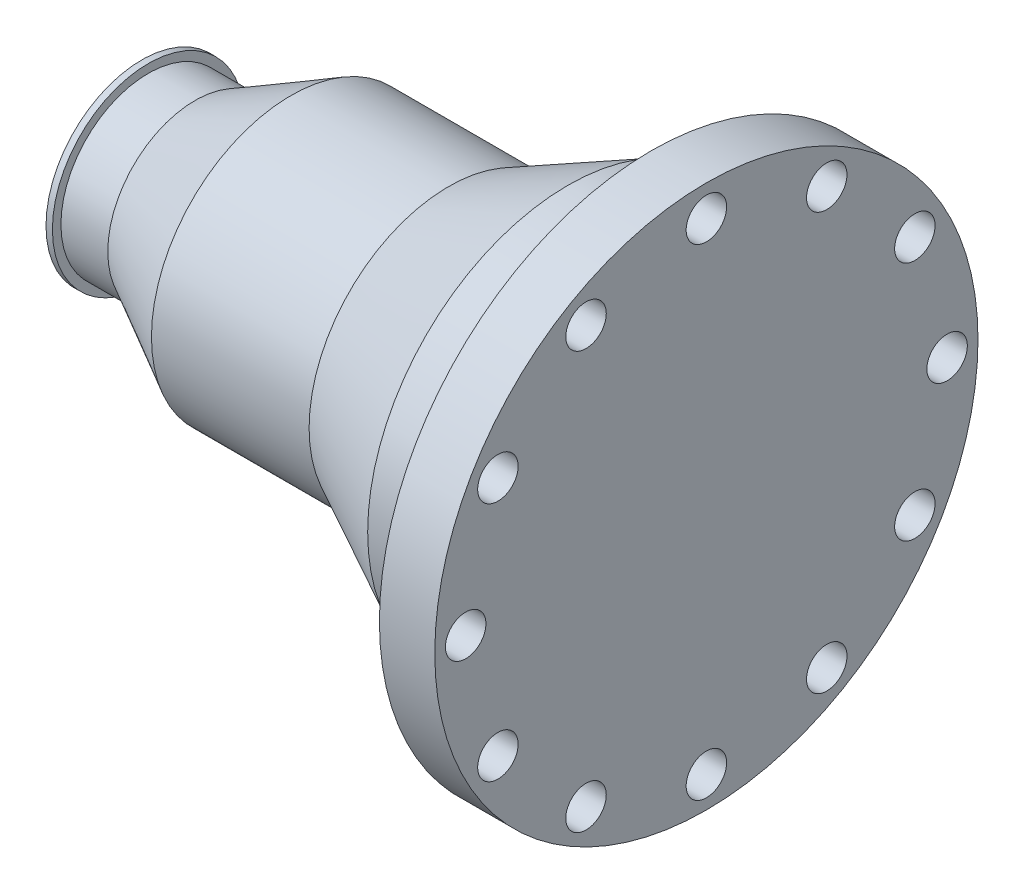
ISO-10303-21;
HEADER;
FILE_DESCRIPTION(('STEP AP214'),'2;1');
FILE_NAME('part.step','',(''),(''),'','','');
FILE_SCHEMA(('AUTOMOTIVE_DESIGN { 1 0 10303 214 1 1 1 1 }'));
ENDSEC;
DATA;
#1=APPLICATION_CONTEXT('core data for automotive mechanical design processes');
#2=APPLICATION_PROTOCOL_DEFINITION('international standard','automotive_design',2000,#1);
#3=PRODUCT_CONTEXT('',#1,'mechanical');
#4=PRODUCT('Part','Part','',(#3));
#5=PRODUCT_RELATED_PRODUCT_CATEGORY('part','',(#4));
#6=PRODUCT_DEFINITION_FORMATION('','',#4);
#7=PRODUCT_DEFINITION_CONTEXT('part definition',#1,'design');
#8=PRODUCT_DEFINITION('design','',#6,#7);
#9=PRODUCT_DEFINITION_SHAPE('','',#8);
#10=(LENGTH_UNIT() NAMED_UNIT(*) SI_UNIT(.MILLI.,.METRE.));
#11=(NAMED_UNIT(*) PLANE_ANGLE_UNIT() SI_UNIT($,.RADIAN.));
#12=(NAMED_UNIT(*) SI_UNIT($,.STERADIAN.) SOLID_ANGLE_UNIT());
#13=UNCERTAINTY_MEASURE_WITH_UNIT(LENGTH_MEASURE(1.E-05),#10,'distance_accuracy_value','');
#14=(GEOMETRIC_REPRESENTATION_CONTEXT(3) GLOBAL_UNCERTAINTY_ASSIGNED_CONTEXT((#13)) GLOBAL_UNIT_ASSIGNED_CONTEXT((#10,
#11,#12)) REPRESENTATION_CONTEXT('',''));
#15=CARTESIAN_POINT('',(0.,0.,0.));
#16=DIRECTION('',(0.,0.,1.));
#17=DIRECTION('',(1.,0.,0.));
#18=AXIS2_PLACEMENT_3D('',#15,#16,#17);
#19=CARTESIAN_POINT('',(0.,0.,0.));
#20=DIRECTION('',(1.,0.,0.));
#21=DIRECTION('',(0.,0.,-1.));
#22=AXIS2_PLACEMENT_3D('',#19,#20,#21);
#23=PLANE('',#22);
#24=CARTESIAN_POINT('',(0.,0.,0.));
#25=DIRECTION('',(-1.,0.,0.));
#26=DIRECTION('',(0.,0.,1.));
#27=AXIS2_PLACEMENT_3D('',#24,#25,#26);
#28=CIRCLE('',#27,45.);
#29=CARTESIAN_POINT('',(0.,0.,45.));
#30=VERTEX_POINT('',#29);
#31=EDGE_CURVE('E10',#30,#30,#28,.T.);
#32=ORIENTED_EDGE('',*,*,#31,.T.);
#33=EDGE_LOOP('',(#32));
#34=FACE_BOUND('',#33,.T.);
#35=ADVANCED_FACE('F37',(#34),#23,.F.);
#36=CARTESIAN_POINT('',(0.,0.,0.));
#37=DIRECTION('',(-1.,0.,0.));
#38=DIRECTION('',(0.,0.,1.));
#39=AXIS2_PLACEMENT_3D('',#36,#37,#38);
#40=CYLINDRICAL_SURFACE('',#39,45.);
#41=ORIENTED_EDGE('',*,*,#31,.F.);
#42=EDGE_LOOP('',(#41));
#43=FACE_BOUND('',#42,.T.);
#44=CARTESIAN_POINT('',(3.,0.,0.));
#45=DIRECTION('',(-1.,0.,0.));
#46=DIRECTION('',(0.,0.,1.));
#47=AXIS2_PLACEMENT_3D('',#44,#45,#46);
#48=CIRCLE('',#47,45.);
#49=CARTESIAN_POINT('',(3.,0.,45.));
#50=VERTEX_POINT('',#49);
#51=EDGE_CURVE('E43',#50,#50,#48,.T.);
#52=ORIENTED_EDGE('',*,*,#51,.T.);
#53=EDGE_LOOP('',(#52));
#54=FACE_BOUND('',#53,.T.);
#55=ADVANCED_FACE('F200',(#43,#54),#40,.T.);
#56=CARTESIAN_POINT('',(3.,45.,0.));
#57=DIRECTION('',(-1.,0.,0.));
#58=DIRECTION('',(0.,0.,1.));
#59=AXIS2_PLACEMENT_3D('',#56,#57,#58);
#60=PLANE('',#59);
#61=ORIENTED_EDGE('',*,*,#51,.F.);
#62=EDGE_LOOP('',(#61));
#63=FACE_BOUND('',#62,.T.);
#64=CARTESIAN_POINT('',(3.,0.,0.));
#65=DIRECTION('',(-1.,0.,0.));
#66=DIRECTION('',(0.,0.,1.));
#67=AXIS2_PLACEMENT_3D('',#64,#65,#66);
#68=CIRCLE('',#67,41.);
#69=CARTESIAN_POINT('',(3.,0.,41.));
#70=VERTEX_POINT('',#69);
#71=EDGE_CURVE('E47',#70,#70,#68,.T.);
#72=ORIENTED_EDGE('',*,*,#71,.T.);
#73=EDGE_LOOP('',(#72));
#74=FACE_BOUND('',#73,.T.);
#75=ADVANCED_FACE('F204',(#63,#74),#60,.F.);
#76=CARTESIAN_POINT('',(0.,0.,0.));
#77=DIRECTION('',(-1.,0.,0.));
#78=DIRECTION('',(0.,0.,1.));
#79=AXIS2_PLACEMENT_3D('',#76,#77,#78);
#80=CYLINDRICAL_SURFACE('',#79,41.);
#81=ORIENTED_EDGE('',*,*,#71,.F.);
#82=EDGE_LOOP('',(#81));
#83=FACE_BOUND('',#82,.T.);
#84=CARTESIAN_POINT('',(25.,0.,0.));
#85=DIRECTION('',(-1.,0.,0.));
#86=DIRECTION('',(0.,0.,1.));
#87=AXIS2_PLACEMENT_3D('',#84,#85,#86);
#88=CIRCLE('',#87,41.);
#89=CARTESIAN_POINT('',(25.,0.,41.));
#90=VERTEX_POINT('',#89);
#91=EDGE_CURVE('E51',#90,#90,#88,.T.);
#92=ORIENTED_EDGE('',*,*,#91,.T.);
#93=EDGE_LOOP('',(#92));
#94=FACE_BOUND('',#93,.T.);
#95=ADVANCED_FACE('F209',(#83,#94),#80,.T.);
#96=CARTESIAN_POINT('',(70.,0.,0.));
#97=DIRECTION('',(1.,0.,0.));
#98=DIRECTION('',(0.,0.,-1.));
#99=AXIS2_PLACEMENT_3D('',#96,#97,#98);
#100=CONICAL_SURFACE('',#99,65.5,0.498567905638218);
#101=ORIENTED_EDGE('',*,*,#91,.F.);
#102=EDGE_LOOP('',(#101));
#103=FACE_BOUND('',#102,.T.);
#104=CARTESIAN_POINT('',(70.,0.,0.));
#105=DIRECTION('',(-1.,0.,0.));
#106=DIRECTION('',(0.,0.,1.));
#107=AXIS2_PLACEMENT_3D('',#104,#105,#106);
#108=CIRCLE('',#107,65.5);
#109=CARTESIAN_POINT('',(70.,0.,65.5));
#110=VERTEX_POINT('',#109);
#111=EDGE_CURVE('E56',#110,#110,#108,.T.);
#112=ORIENTED_EDGE('',*,*,#111,.T.);
#113=EDGE_LOOP('',(#112));
#114=FACE_BOUND('',#113,.T.);
#115=ADVANCED_FACE('F215',(#103,#114),#100,.T.);
#116=CARTESIAN_POINT('',(0.,0.,0.));
#117=DIRECTION('',(-1.,0.,0.));
#118=DIRECTION('',(0.,0.,1.));
#119=AXIS2_PLACEMENT_3D('',#116,#117,#118);
#120=CYLINDRICAL_SURFACE('',#119,65.5);
#121=ORIENTED_EDGE('',*,*,#111,.F.);
#122=EDGE_LOOP('',(#121));
#123=FACE_BOUND('',#122,.T.);
#124=CARTESIAN_POINT('',(144.,0.,0.));
#125=DIRECTION('',(-1.,0.,0.));
#126=DIRECTION('',(0.,0.,1.));
#127=AXIS2_PLACEMENT_3D('',#124,#125,#126);
#128=CIRCLE('',#127,65.5);
#129=CARTESIAN_POINT('',(144.,0.,65.5));
#130=VERTEX_POINT('',#129);
#131=EDGE_CURVE('E59',#130,#130,#128,.T.);
#132=ORIENTED_EDGE('',*,*,#131,.T.);
#133=EDGE_LOOP('',(#132));
#134=FACE_BOUND('',#133,.T.);
#135=ADVANCED_FACE('F219',(#123,#134),#120,.T.);
#136=CARTESIAN_POINT('',(200.,0.,0.));
#137=DIRECTION('',(1.,0.,0.));
#138=DIRECTION('',(0.,0.,-1.));
#139=AXIS2_PLACEMENT_3D('',#136,#137,#138);
#140=CONICAL_SURFACE('',#139,94.,0.470764926542016);
#141=ORIENTED_EDGE('',*,*,#131,.F.);
#142=EDGE_LOOP('',(#141));
#143=FACE_BOUND('',#142,.T.);
#144=CARTESIAN_POINT('',(200.,0.,0.));
#145=DIRECTION('',(-1.,0.,0.));
#146=DIRECTION('',(0.,0.,1.));
#147=AXIS2_PLACEMENT_3D('',#144,#145,#146);
#148=CIRCLE('',#147,94.);
#149=CARTESIAN_POINT('',(200.,0.,94.));
#150=VERTEX_POINT('',#149);
#151=EDGE_CURVE('E62',#150,#150,#148,.T.);
#152=ORIENTED_EDGE('',*,*,#151,.T.);
#153=EDGE_LOOP('',(#152));
#154=FACE_BOUND('',#153,.T.);
#155=ADVANCED_FACE('F223',(#143,#154),#140,.T.);
#156=CARTESIAN_POINT('',(0.,0.,0.));
#157=DIRECTION('',(-1.,0.,0.));
#158=DIRECTION('',(0.,0.,1.));
#159=AXIS2_PLACEMENT_3D('',#156,#157,#158);
#160=CYLINDRICAL_SURFACE('',#159,94.);
#161=ORIENTED_EDGE('',*,*,#151,.F.);
#162=EDGE_LOOP('',(#161));
#163=FACE_BOUND('',#162,.T.);
#164=CARTESIAN_POINT('',(220.,0.,0.));
#165=DIRECTION('',(-1.,0.,0.));
#166=DIRECTION('',(0.,0.,1.));
#167=AXIS2_PLACEMENT_3D('',#164,#165,#166);
#168=CIRCLE('',#167,94.);
#169=CARTESIAN_POINT('',(220.,0.,94.));
#170=VERTEX_POINT('',#169);
#171=EDGE_CURVE('E65',#170,#170,#168,.T.);
#172=ORIENTED_EDGE('',*,*,#171,.T.);
#173=EDGE_LOOP('',(#172));
#174=FACE_BOUND('',#173,.T.);
#175=ADVANCED_FACE('F227',(#163,#174),#160,.T.);
#176=CARTESIAN_POINT('',(220.,94.,0.));
#177=DIRECTION('',(1.,0.,0.));
#178=DIRECTION('',(0.,0.,-1.));
#179=AXIS2_PLACEMENT_3D('',#176,#177,#178);
#180=PLANE('',#179);
#181=ORIENTED_EDGE('',*,*,#171,.F.);
#182=EDGE_LOOP('',(#181));
#183=FACE_BOUND('',#182,.T.);
#184=CARTESIAN_POINT('',(220.,0.,0.));
#185=DIRECTION('',(-1.,0.,0.));
#186=DIRECTION('',(0.,0.,1.));
#187=AXIS2_PLACEMENT_3D('',#184,#185,#186);
#188=CIRCLE('',#187,95.);
#189=CARTESIAN_POINT('',(220.,0.,95.));
#190=VERTEX_POINT('',#189);
#191=EDGE_CURVE('E68',#190,#190,#188,.T.);
#192=ORIENTED_EDGE('',*,*,#191,.T.);
#193=EDGE_LOOP('',(#192));
#194=FACE_BOUND('',#193,.T.);
#195=ADVANCED_FACE('F231',(#183,#194),#180,.F.);
#196=CARTESIAN_POINT('',(0.,0.,0.));
#197=DIRECTION('',(-1.,0.,0.));
#198=DIRECTION('',(0.,0.,1.));
#199=AXIS2_PLACEMENT_3D('',#196,#197,#198);
#200=CYLINDRICAL_SURFACE('',#199,95.);
#201=ORIENTED_EDGE('',*,*,#191,.F.);
#202=EDGE_LOOP('',(#201));
#203=FACE_BOUND('',#202,.T.);
#204=CARTESIAN_POINT('',(239.,0.,0.));
#205=DIRECTION('',(-1.,0.,0.));
#206=DIRECTION('',(0.,0.,1.));
#207=AXIS2_PLACEMENT_3D('',#204,#205,#206);
#208=CIRCLE('',#207,95.);
#209=CARTESIAN_POINT('',(239.,0.,95.));
#210=VERTEX_POINT('',#209);
#211=EDGE_CURVE('E71',#210,#210,#208,.T.);
#212=ORIENTED_EDGE('',*,*,#211,.T.);
#213=EDGE_LOOP('',(#212));
#214=FACE_BOUND('',#213,.T.);
#215=ADVANCED_FACE('F195',(#203,#214),#200,.T.);
#216=CARTESIAN_POINT('',(239.,100.,0.));
#217=DIRECTION('',(1.,0.,0.));
#218=DIRECTION('',(0.,0.,-1.));
#219=AXIS2_PLACEMENT_3D('',#216,#217,#218);
#220=PLANE('',#219);
#221=CARTESIAN_POINT('',(239.,97.8608706276416,-56.5));
#222=DIRECTION('',(1.,0.,0.));
#223=DIRECTION('',(0.,0.,-1.));
#224=AXIS2_PLACEMENT_3D('',#221,#222,#223);
#225=CIRCLE('',#224,9.50000000000001);
#226=CARTESIAN_POINT('',(239.,97.8608706276416,-66.));
#227=VERTEX_POINT('',#226);
#228=EDGE_CURVE('E146',#227,#227,#225,.F.);
#229=ORIENTED_EDGE('',*,*,#228,.F.);
#230=EDGE_LOOP('',(#229));
#231=FACE_BOUND('',#230,.T.);
#232=CARTESIAN_POINT('',(239.,56.4999999999999,-97.8608706276416));
#233=DIRECTION('',(1.,0.,0.));
#234=DIRECTION('',(0.,0.,-1.));
#235=AXIS2_PLACEMENT_3D('',#232,#233,#234);
#236=CIRCLE('',#235,9.5);
#237=CARTESIAN_POINT('',(239.,56.4999999999999,-107.360870627642));
#238=VERTEX_POINT('',#237);
#239=EDGE_CURVE('E140',#238,#238,#236,.F.);
#240=ORIENTED_EDGE('',*,*,#239,.F.);
#241=EDGE_LOOP('',(#240));
#242=FACE_BOUND('',#241,.T.);
#243=CARTESIAN_POINT('',(239.,0.,-113.));
#244=DIRECTION('',(1.,0.,0.));
#245=DIRECTION('',(0.,0.,-1.));
#246=AXIS2_PLACEMENT_3D('',#243,#244,#245);
#247=CIRCLE('',#246,9.49999999999999);
#248=CARTESIAN_POINT('',(239.,0.,-122.5));
#249=VERTEX_POINT('',#248);
#250=EDGE_CURVE('E134',#249,#249,#247,.F.);
#251=ORIENTED_EDGE('',*,*,#250,.F.);
#252=EDGE_LOOP('',(#251));
#253=FACE_BOUND('',#252,.T.);
#254=CARTESIAN_POINT('',(239.,-56.5,-97.8608706276415));
#255=DIRECTION('',(1.,0.,0.));
#256=DIRECTION('',(0.,0.,-1.));
#257=AXIS2_PLACEMENT_3D('',#254,#255,#256);
#258=CIRCLE('',#257,9.5);
#259=CARTESIAN_POINT('',(239.,-56.5,-107.360870627642));
#260=VERTEX_POINT('',#259);
#261=EDGE_CURVE('E128',#260,#260,#258,.F.);
#262=ORIENTED_EDGE('',*,*,#261,.F.);
#263=EDGE_LOOP('',(#262));
#264=FACE_BOUND('',#263,.T.);
#265=CARTESIAN_POINT('',(239.,-97.8608706276416,-56.5));
#266=DIRECTION('',(1.,0.,0.));
#267=DIRECTION('',(0.,0.,-1.));
#268=AXIS2_PLACEMENT_3D('',#265,#266,#267);
#269=CIRCLE('',#268,9.50000000000001);
#270=CARTESIAN_POINT('',(239.,-97.8608706276416,-66.));
#271=VERTEX_POINT('',#270);
#272=EDGE_CURVE('E122',#271,#271,#269,.F.);
#273=ORIENTED_EDGE('',*,*,#272,.F.);
#274=EDGE_LOOP('',(#273));
#275=FACE_BOUND('',#274,.T.);
#276=CARTESIAN_POINT('',(239.,-113.,0.));
#277=DIRECTION('',(1.,0.,0.));
#278=DIRECTION('',(0.,0.,-1.));
#279=AXIS2_PLACEMENT_3D('',#276,#277,#278);
#280=CIRCLE('',#279,9.49999999999998);
#281=CARTESIAN_POINT('',(239.,-113.,-9.49999999999998));
#282=VERTEX_POINT('',#281);
#283=EDGE_CURVE('E116',#282,#282,#280,.F.);
#284=ORIENTED_EDGE('',*,*,#283,.F.);
#285=EDGE_LOOP('',(#284));
#286=FACE_BOUND('',#285,.T.);
#287=CARTESIAN_POINT('',(239.,-97.8608706276415,56.5));
#288=DIRECTION('',(1.,0.,0.));
#289=DIRECTION('',(0.,0.,-1.));
#290=AXIS2_PLACEMENT_3D('',#287,#288,#289);
#291=CIRCLE('',#290,9.5);
#292=CARTESIAN_POINT('',(239.,-97.8608706276415,47.));
#293=VERTEX_POINT('',#292);
#294=EDGE_CURVE('E110',#293,#293,#291,.F.);
#295=ORIENTED_EDGE('',*,*,#294,.F.);
#296=EDGE_LOOP('',(#295));
#297=FACE_BOUND('',#296,.T.);
#298=CARTESIAN_POINT('',(239.,-56.5,97.8608706276416));
#299=DIRECTION('',(1.,0.,0.));
#300=DIRECTION('',(0.,0.,-1.));
#301=AXIS2_PLACEMENT_3D('',#298,#299,#300);
#302=CIRCLE('',#301,9.5);
#303=CARTESIAN_POINT('',(239.,-56.5,88.3608706276416));
#304=VERTEX_POINT('',#303);
#305=EDGE_CURVE('E104',#304,#304,#302,.F.);
#306=ORIENTED_EDGE('',*,*,#305,.F.);
#307=EDGE_LOOP('',(#306));
#308=FACE_BOUND('',#307,.T.);
#309=CARTESIAN_POINT('',(239.,0.,113.));
#310=DIRECTION('',(1.,0.,0.));
#311=DIRECTION('',(0.,0.,-1.));
#312=AXIS2_PLACEMENT_3D('',#309,#310,#311);
#313=CIRCLE('',#312,9.49999999999999);
#314=CARTESIAN_POINT('',(239.,0.,103.5));
#315=VERTEX_POINT('',#314);
#316=EDGE_CURVE('E98',#315,#315,#313,.F.);
#317=ORIENTED_EDGE('',*,*,#316,.F.);
#318=EDGE_LOOP('',(#317));
#319=FACE_BOUND('',#318,.T.);
#320=CARTESIAN_POINT('',(239.,56.5,97.8608706276416));
#321=DIRECTION('',(1.,0.,0.));
#322=DIRECTION('',(0.,0.,-1.));
#323=AXIS2_PLACEMENT_3D('',#320,#321,#322);
#324=CIRCLE('',#323,9.5);
#325=CARTESIAN_POINT('',(239.,56.5,88.3608706276416));
#326=VERTEX_POINT('',#325);
#327=EDGE_CURVE('E92',#326,#326,#324,.F.);
#328=ORIENTED_EDGE('',*,*,#327,.F.);
#329=EDGE_LOOP('',(#328));
#330=FACE_BOUND('',#329,.T.);
#331=CARTESIAN_POINT('',(239.,97.8608706276416,56.5));
#332=DIRECTION('',(1.,0.,0.));
#333=DIRECTION('',(0.,0.,-1.));
#334=AXIS2_PLACEMENT_3D('',#331,#332,#333);
#335=CIRCLE('',#334,9.5);
#336=CARTESIAN_POINT('',(239.,97.8608706276416,47.));
#337=VERTEX_POINT('',#336);
#338=EDGE_CURVE('E86',#337,#337,#335,.F.);
#339=ORIENTED_EDGE('',*,*,#338,.F.);
#340=EDGE_LOOP('',(#339));
#341=FACE_BOUND('',#340,.T.);
#342=CARTESIAN_POINT('',(239.,113.,0.));
#343=DIRECTION('',(1.,0.,0.));
#344=DIRECTION('',(0.,0.,-1.));
#345=AXIS2_PLACEMENT_3D('',#342,#343,#344);
#346=CIRCLE('',#345,9.50000000000001);
#347=CARTESIAN_POINT('',(239.,113.,-9.50000000000001));
#348=VERTEX_POINT('',#347);
#349=EDGE_CURVE('E80',#348,#348,#346,.F.);
#350=ORIENTED_EDGE('',*,*,#349,.F.);
#351=EDGE_LOOP('',(#350));
#352=FACE_BOUND('',#351,.T.);
#353=ORIENTED_EDGE('',*,*,#211,.F.);
#354=EDGE_LOOP('',(#353));
#355=FACE_BOUND('',#354,.T.);
#356=CARTESIAN_POINT('',(239.,0.,0.));
#357=DIRECTION('',(-1.,0.,0.));
#358=DIRECTION('',(0.,0.,1.));
#359=AXIS2_PLACEMENT_3D('',#356,#357,#358);
#360=CIRCLE('',#359,127.5);
#361=CARTESIAN_POINT('',(239.,0.,127.5));
#362=VERTEX_POINT('',#361);
#363=EDGE_CURVE('E74',#362,#362,#360,.T.);
#364=ORIENTED_EDGE('',*,*,#363,.T.);
#365=EDGE_LOOP('',(#364));
#366=FACE_BOUND('',#365,.T.);
#367=ADVANCED_FACE('F187',(#231,#242,#253,#264,#275,#286,#297,#308,#319,#330,#341,#352,#355,
#366),#220,.F.);
#368=CARTESIAN_POINT('',(0.,0.,0.));
#369=DIRECTION('',(-1.,0.,0.));
#370=DIRECTION('',(0.,0.,1.));
#371=AXIS2_PLACEMENT_3D('',#368,#369,#370);
#372=CYLINDRICAL_SURFACE('',#371,127.5);
#373=ORIENTED_EDGE('',*,*,#363,.F.);
#374=EDGE_LOOP('',(#373));
#375=FACE_BOUND('',#374,.T.);
#376=CARTESIAN_POINT('',(265.,0.,0.));
#377=DIRECTION('',(-1.,0.,0.));
#378=DIRECTION('',(0.,0.,1.));
#379=AXIS2_PLACEMENT_3D('',#376,#377,#378);
#380=CIRCLE('',#379,127.5);
#381=CARTESIAN_POINT('',(265.,0.,127.5));
#382=VERTEX_POINT('',#381);
#383=EDGE_CURVE('E77',#382,#382,#380,.T.);
#384=ORIENTED_EDGE('',*,*,#383,.T.);
#385=EDGE_LOOP('',(#384));
#386=FACE_BOUND('',#385,.T.);
#387=ADVANCED_FACE('F160',(#375,#386),#372,.T.);
#388=CARTESIAN_POINT('',(265.,127.5,0.));
#389=DIRECTION('',(-1.,0.,0.));
#390=DIRECTION('',(0.,0.,1.));
#391=AXIS2_PLACEMENT_3D('',#388,#389,#390);
#392=PLANE('',#391);
#393=CARTESIAN_POINT('',(265.,97.8608706276416,-56.5));
#394=DIRECTION('',(1.,0.,0.));
#395=DIRECTION('',(0.,0.,-1.));
#396=AXIS2_PLACEMENT_3D('',#393,#394,#395);
#397=CIRCLE('',#396,9.50000000000001);
#398=CARTESIAN_POINT('',(265.,97.8608706276416,-66.));
#399=VERTEX_POINT('',#398);
#400=EDGE_CURVE('E149',#399,#399,#397,.T.);
#401=ORIENTED_EDGE('',*,*,#400,.F.);
#402=EDGE_LOOP('',(#401));
#403=FACE_BOUND('',#402,.T.);
#404=CARTESIAN_POINT('',(265.,56.4999999999999,-97.8608706276416));
#405=DIRECTION('',(1.,0.,0.));
#406=DIRECTION('',(0.,0.,-1.));
#407=AXIS2_PLACEMENT_3D('',#404,#405,#406);
#408=CIRCLE('',#407,9.5);
#409=CARTESIAN_POINT('',(265.,56.4999999999999,-107.360870627642));
#410=VERTEX_POINT('',#409);
#411=EDGE_CURVE('E143',#410,#410,#408,.T.);
#412=ORIENTED_EDGE('',*,*,#411,.F.);
#413=EDGE_LOOP('',(#412));
#414=FACE_BOUND('',#413,.T.);
#415=CARTESIAN_POINT('',(265.,0.,-113.));
#416=DIRECTION('',(1.,0.,0.));
#417=DIRECTION('',(0.,0.,-1.));
#418=AXIS2_PLACEMENT_3D('',#415,#416,#417);
#419=CIRCLE('',#418,9.49999999999999);
#420=CARTESIAN_POINT('',(265.,0.,-122.5));
#421=VERTEX_POINT('',#420);
#422=EDGE_CURVE('E137',#421,#421,#419,.T.);
#423=ORIENTED_EDGE('',*,*,#422,.F.);
#424=EDGE_LOOP('',(#423));
#425=FACE_BOUND('',#424,.T.);
#426=CARTESIAN_POINT('',(265.,-56.5,-97.8608706276415));
#427=DIRECTION('',(1.,0.,0.));
#428=DIRECTION('',(0.,0.,-1.));
#429=AXIS2_PLACEMENT_3D('',#426,#427,#428);
#430=CIRCLE('',#429,9.5);
#431=CARTESIAN_POINT('',(265.,-56.5,-107.360870627642));
#432=VERTEX_POINT('',#431);
#433=EDGE_CURVE('E131',#432,#432,#430,.T.);
#434=ORIENTED_EDGE('',*,*,#433,.F.);
#435=EDGE_LOOP('',(#434));
#436=FACE_BOUND('',#435,.T.);
#437=CARTESIAN_POINT('',(265.,-97.8608706276416,-56.5));
#438=DIRECTION('',(1.,0.,0.));
#439=DIRECTION('',(0.,0.,-1.));
#440=AXIS2_PLACEMENT_3D('',#437,#438,#439);
#441=CIRCLE('',#440,9.50000000000001);
#442=CARTESIAN_POINT('',(265.,-97.8608706276416,-66.));
#443=VERTEX_POINT('',#442);
#444=EDGE_CURVE('E125',#443,#443,#441,.T.);
#445=ORIENTED_EDGE('',*,*,#444,.F.);
#446=EDGE_LOOP('',(#445));
#447=FACE_BOUND('',#446,.T.);
#448=CARTESIAN_POINT('',(265.,-113.,0.));
#449=DIRECTION('',(1.,0.,0.));
#450=DIRECTION('',(0.,0.,-1.));
#451=AXIS2_PLACEMENT_3D('',#448,#449,#450);
#452=CIRCLE('',#451,9.49999999999998);
#453=CARTESIAN_POINT('',(265.,-113.,-9.49999999999998));
#454=VERTEX_POINT('',#453);
#455=EDGE_CURVE('E119',#454,#454,#452,.T.);
#456=ORIENTED_EDGE('',*,*,#455,.F.);
#457=EDGE_LOOP('',(#456));
#458=FACE_BOUND('',#457,.T.);
#459=CARTESIAN_POINT('',(265.,-97.8608706276415,56.5));
#460=DIRECTION('',(1.,0.,0.));
#461=DIRECTION('',(0.,0.,-1.));
#462=AXIS2_PLACEMENT_3D('',#459,#460,#461);
#463=CIRCLE('',#462,9.5);
#464=CARTESIAN_POINT('',(265.,-97.8608706276415,47.));
#465=VERTEX_POINT('',#464);
#466=EDGE_CURVE('E113',#465,#465,#463,.T.);
#467=ORIENTED_EDGE('',*,*,#466,.F.);
#468=EDGE_LOOP('',(#467));
#469=FACE_BOUND('',#468,.T.);
#470=CARTESIAN_POINT('',(265.,-56.5,97.8608706276416));
#471=DIRECTION('',(1.,0.,0.));
#472=DIRECTION('',(0.,0.,-1.));
#473=AXIS2_PLACEMENT_3D('',#470,#471,#472);
#474=CIRCLE('',#473,9.5);
#475=CARTESIAN_POINT('',(265.,-56.5,88.3608706276416));
#476=VERTEX_POINT('',#475);
#477=EDGE_CURVE('E107',#476,#476,#474,.T.);
#478=ORIENTED_EDGE('',*,*,#477,.F.);
#479=EDGE_LOOP('',(#478));
#480=FACE_BOUND('',#479,.T.);
#481=CARTESIAN_POINT('',(265.,0.,113.));
#482=DIRECTION('',(1.,0.,0.));
#483=DIRECTION('',(0.,0.,-1.));
#484=AXIS2_PLACEMENT_3D('',#481,#482,#483);
#485=CIRCLE('',#484,9.49999999999999);
#486=CARTESIAN_POINT('',(265.,0.,103.5));
#487=VERTEX_POINT('',#486);
#488=EDGE_CURVE('E101',#487,#487,#485,.T.);
#489=ORIENTED_EDGE('',*,*,#488,.F.);
#490=EDGE_LOOP('',(#489));
#491=FACE_BOUND('',#490,.T.);
#492=CARTESIAN_POINT('',(265.,56.5,97.8608706276416));
#493=DIRECTION('',(1.,0.,0.));
#494=DIRECTION('',(0.,0.,-1.));
#495=AXIS2_PLACEMENT_3D('',#492,#493,#494);
#496=CIRCLE('',#495,9.5);
#497=CARTESIAN_POINT('',(265.,56.5,88.3608706276416));
#498=VERTEX_POINT('',#497);
#499=EDGE_CURVE('E95',#498,#498,#496,.T.);
#500=ORIENTED_EDGE('',*,*,#499,.F.);
#501=EDGE_LOOP('',(#500));
#502=FACE_BOUND('',#501,.T.);
#503=CARTESIAN_POINT('',(265.,97.8608706276416,56.5));
#504=DIRECTION('',(1.,0.,0.));
#505=DIRECTION('',(0.,0.,-1.));
#506=AXIS2_PLACEMENT_3D('',#503,#504,#505);
#507=CIRCLE('',#506,9.5);
#508=CARTESIAN_POINT('',(265.,97.8608706276416,47.));
#509=VERTEX_POINT('',#508);
#510=EDGE_CURVE('E89',#509,#509,#507,.T.);
#511=ORIENTED_EDGE('',*,*,#510,.F.);
#512=EDGE_LOOP('',(#511));
#513=FACE_BOUND('',#512,.T.);
#514=CARTESIAN_POINT('',(265.,113.,0.));
#515=DIRECTION('',(1.,0.,0.));
#516=DIRECTION('',(0.,0.,-1.));
#517=AXIS2_PLACEMENT_3D('',#514,#515,#516);
#518=CIRCLE('',#517,9.50000000000001);
#519=CARTESIAN_POINT('',(265.,113.,-9.50000000000001));
#520=VERTEX_POINT('',#519);
#521=EDGE_CURVE('E83',#520,#520,#518,.T.);
#522=ORIENTED_EDGE('',*,*,#521,.F.);
#523=EDGE_LOOP('',(#522));
#524=FACE_BOUND('',#523,.T.);
#525=ORIENTED_EDGE('',*,*,#383,.F.);
#526=EDGE_LOOP('',(#525));
#527=FACE_BOUND('',#526,.T.);
#528=ADVANCED_FACE('F156',(#403,#414,#425,#436,#447,#458,#469,#480,#491,#502,#513,#524,#527),
#392,.F.);
#529=CARTESIAN_POINT('',(265.,113.,0.));
#530=DIRECTION('',(-1.,0.,0.));
#531=DIRECTION('',(0.,0.,1.));
#532=AXIS2_PLACEMENT_3D('',#529,#530,#531);
#533=CYLINDRICAL_SURFACE('',#532,9.50000000000001);
#534=ORIENTED_EDGE('',*,*,#521,.T.);
#535=EDGE_LOOP('',(#534));
#536=FACE_BOUND('',#535,.T.);
#537=ORIENTED_EDGE('',*,*,#349,.T.);
#538=EDGE_LOOP('',(#537));
#539=FACE_BOUND('',#538,.T.);
#540=ADVANCED_FACE('F159',(#536,#539),#533,.F.);
#541=CARTESIAN_POINT('',(265.,97.8608706276416,56.5));
#542=DIRECTION('',(-1.,0.,0.));
#543=DIRECTION('',(0.,0.,1.));
#544=AXIS2_PLACEMENT_3D('',#541,#542,#543);
#545=CYLINDRICAL_SURFACE('',#544,9.5);
#546=ORIENTED_EDGE('',*,*,#510,.T.);
#547=EDGE_LOOP('',(#546));
#548=FACE_BOUND('',#547,.T.);
#549=ORIENTED_EDGE('',*,*,#338,.T.);
#550=EDGE_LOOP('',(#549));
#551=FACE_BOUND('',#550,.T.);
#552=ADVANCED_FACE('F318',(#548,#551),#545,.F.);
#553=CARTESIAN_POINT('',(265.,56.5,97.8608706276416));
#554=DIRECTION('',(-1.,0.,0.));
#555=DIRECTION('',(0.,0.,1.));
#556=AXIS2_PLACEMENT_3D('',#553,#554,#555);
#557=CYLINDRICAL_SURFACE('',#556,9.5);
#558=ORIENTED_EDGE('',*,*,#499,.T.);
#559=EDGE_LOOP('',(#558));
#560=FACE_BOUND('',#559,.T.);
#561=ORIENTED_EDGE('',*,*,#327,.T.);
#562=EDGE_LOOP('',(#561));
#563=FACE_BOUND('',#562,.T.);
#564=ADVANCED_FACE('F327',(#560,#563),#557,.F.);
#565=CARTESIAN_POINT('',(265.,0.,113.));
#566=DIRECTION('',(-1.,0.,0.));
#567=DIRECTION('',(0.,0.,1.));
#568=AXIS2_PLACEMENT_3D('',#565,#566,#567);
#569=CYLINDRICAL_SURFACE('',#568,9.49999999999999);
#570=ORIENTED_EDGE('',*,*,#488,.T.);
#571=EDGE_LOOP('',(#570));
#572=FACE_BOUND('',#571,.T.);
#573=ORIENTED_EDGE('',*,*,#316,.T.);
#574=EDGE_LOOP('',(#573));
#575=FACE_BOUND('',#574,.T.);
#576=ADVANCED_FACE('F336',(#572,#575),#569,.F.);
#577=CARTESIAN_POINT('',(265.,-56.5,97.8608706276416));
#578=DIRECTION('',(-1.,0.,0.));
#579=DIRECTION('',(0.,0.,1.));
#580=AXIS2_PLACEMENT_3D('',#577,#578,#579);
#581=CYLINDRICAL_SURFACE('',#580,9.5);
#582=ORIENTED_EDGE('',*,*,#477,.T.);
#583=EDGE_LOOP('',(#582));
#584=FACE_BOUND('',#583,.T.);
#585=ORIENTED_EDGE('',*,*,#305,.T.);
#586=EDGE_LOOP('',(#585));
#587=FACE_BOUND('',#586,.T.);
#588=ADVANCED_FACE('F345',(#584,#587),#581,.F.);
#589=CARTESIAN_POINT('',(265.,-97.8608706276415,56.5));
#590=DIRECTION('',(-1.,0.,0.));
#591=DIRECTION('',(0.,0.,1.));
#592=AXIS2_PLACEMENT_3D('',#589,#590,#591);
#593=CYLINDRICAL_SURFACE('',#592,9.5);
#594=ORIENTED_EDGE('',*,*,#466,.T.);
#595=EDGE_LOOP('',(#594));
#596=FACE_BOUND('',#595,.T.);
#597=ORIENTED_EDGE('',*,*,#294,.T.);
#598=EDGE_LOOP('',(#597));
#599=FACE_BOUND('',#598,.T.);
#600=ADVANCED_FACE('F354',(#596,#599),#593,.F.);
#601=CARTESIAN_POINT('',(265.,-113.,0.));
#602=DIRECTION('',(-1.,0.,0.));
#603=DIRECTION('',(0.,0.,1.));
#604=AXIS2_PLACEMENT_3D('',#601,#602,#603);
#605=CYLINDRICAL_SURFACE('',#604,9.49999999999998);
#606=ORIENTED_EDGE('',*,*,#455,.T.);
#607=EDGE_LOOP('',(#606));
#608=FACE_BOUND('',#607,.T.);
#609=ORIENTED_EDGE('',*,*,#283,.T.);
#610=EDGE_LOOP('',(#609));
#611=FACE_BOUND('',#610,.T.);
#612=ADVANCED_FACE('F363',(#608,#611),#605,.F.);
#613=CARTESIAN_POINT('',(265.,-97.8608706276416,-56.5));
#614=DIRECTION('',(-1.,0.,0.));
#615=DIRECTION('',(0.,0.,1.));
#616=AXIS2_PLACEMENT_3D('',#613,#614,#615);
#617=CYLINDRICAL_SURFACE('',#616,9.50000000000001);
#618=ORIENTED_EDGE('',*,*,#444,.T.);
#619=EDGE_LOOP('',(#618));
#620=FACE_BOUND('',#619,.T.);
#621=ORIENTED_EDGE('',*,*,#272,.T.);
#622=EDGE_LOOP('',(#621));
#623=FACE_BOUND('',#622,.T.);
#624=ADVANCED_FACE('F372',(#620,#623),#617,.F.);
#625=CARTESIAN_POINT('',(265.,-56.5,-97.8608706276415));
#626=DIRECTION('',(-1.,0.,0.));
#627=DIRECTION('',(0.,0.,1.));
#628=AXIS2_PLACEMENT_3D('',#625,#626,#627);
#629=CYLINDRICAL_SURFACE('',#628,9.5);
#630=ORIENTED_EDGE('',*,*,#433,.T.);
#631=EDGE_LOOP('',(#630));
#632=FACE_BOUND('',#631,.T.);
#633=ORIENTED_EDGE('',*,*,#261,.T.);
#634=EDGE_LOOP('',(#633));
#635=FACE_BOUND('',#634,.T.);
#636=ADVANCED_FACE('F381',(#632,#635),#629,.F.);
#637=CARTESIAN_POINT('',(265.,0.,-113.));
#638=DIRECTION('',(-1.,0.,0.));
#639=DIRECTION('',(0.,0.,1.));
#640=AXIS2_PLACEMENT_3D('',#637,#638,#639);
#641=CYLINDRICAL_SURFACE('',#640,9.49999999999999);
#642=ORIENTED_EDGE('',*,*,#422,.T.);
#643=EDGE_LOOP('',(#642));
#644=FACE_BOUND('',#643,.T.);
#645=ORIENTED_EDGE('',*,*,#250,.T.);
#646=EDGE_LOOP('',(#645));
#647=FACE_BOUND('',#646,.T.);
#648=ADVANCED_FACE('F390',(#644,#647),#641,.F.);
#649=CARTESIAN_POINT('',(265.,56.4999999999999,-97.8608706276416));
#650=DIRECTION('',(-1.,0.,0.));
#651=DIRECTION('',(0.,0.,1.));
#652=AXIS2_PLACEMENT_3D('',#649,#650,#651);
#653=CYLINDRICAL_SURFACE('',#652,9.5);
#654=ORIENTED_EDGE('',*,*,#411,.T.);
#655=EDGE_LOOP('',(#654));
#656=FACE_BOUND('',#655,.T.);
#657=ORIENTED_EDGE('',*,*,#239,.T.);
#658=EDGE_LOOP('',(#657));
#659=FACE_BOUND('',#658,.T.);
#660=ADVANCED_FACE('F399',(#656,#659),#653,.F.);
#661=CARTESIAN_POINT('',(265.,97.8608706276416,-56.5));
#662=DIRECTION('',(-1.,0.,0.));
#663=DIRECTION('',(0.,0.,1.));
#664=AXIS2_PLACEMENT_3D('',#661,#662,#663);
#665=CYLINDRICAL_SURFACE('',#664,9.50000000000001);
#666=ORIENTED_EDGE('',*,*,#400,.T.);
#667=EDGE_LOOP('',(#666));
#668=FACE_BOUND('',#667,.T.);
#669=ORIENTED_EDGE('',*,*,#228,.T.);
#670=EDGE_LOOP('',(#669));
#671=FACE_BOUND('',#670,.T.);
#672=ADVANCED_FACE('F153',(#668,#671),#665,.F.);
#673=CLOSED_SHELL('',(#35,#55,#75,#95,#115,#135,#155,#175,#195,#215,#367,#387,#528,#540,#552,
#564,#576,#588,#600,#612,#624,#636,#648,#660,#672));
#674=MANIFOLD_SOLID_BREP('B2',#673);
#675=ADVANCED_BREP_SHAPE_REPRESENTATION('',(#18,#674),#14);
#676=SHAPE_DEFINITION_REPRESENTATION(#9,#675);
ENDSEC;
END-ISO-10303-21;
